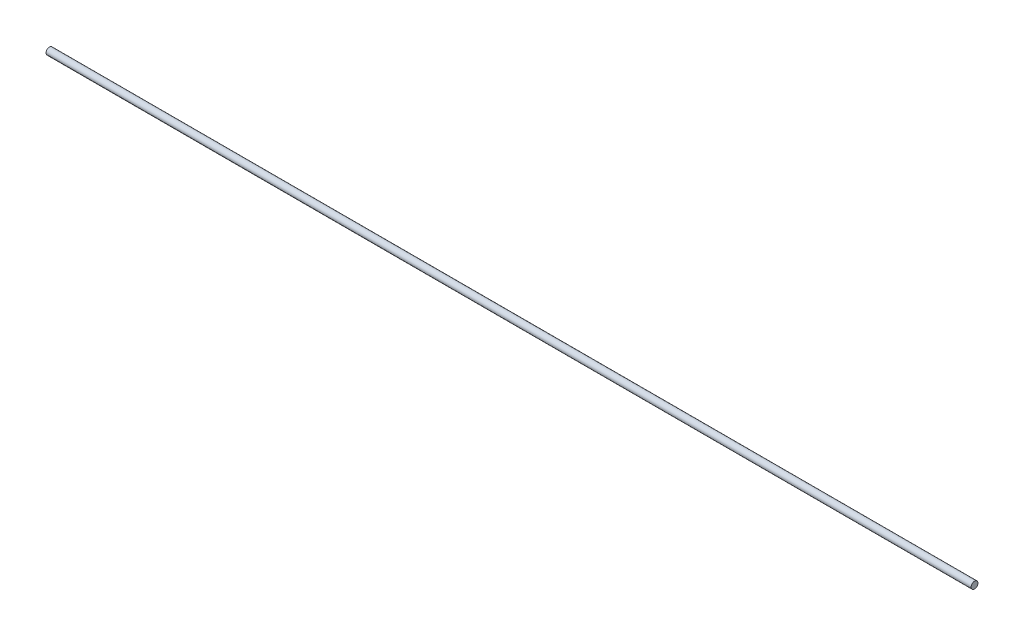
ISO-10303-21;
HEADER;
FILE_DESCRIPTION(('STEP AP214'),'2;1');
FILE_NAME('part.step','',(''),(''),'','','');
FILE_SCHEMA(('AUTOMOTIVE_DESIGN { 1 0 10303 214 1 1 1 1 }'));
ENDSEC;
DATA;
#1=APPLICATION_CONTEXT('core data for automotive mechanical design processes');
#2=APPLICATION_PROTOCOL_DEFINITION('international standard','automotive_design',2000,#1);
#3=PRODUCT_CONTEXT('',#1,'mechanical');
#4=PRODUCT('Part','Part','',(#3));
#5=PRODUCT_RELATED_PRODUCT_CATEGORY('part','',(#4));
#6=PRODUCT_DEFINITION_FORMATION('','',#4);
#7=PRODUCT_DEFINITION_CONTEXT('part definition',#1,'design');
#8=PRODUCT_DEFINITION('design','',#6,#7);
#9=PRODUCT_DEFINITION_SHAPE('','',#8);
#10=(LENGTH_UNIT() NAMED_UNIT(*) SI_UNIT(.MILLI.,.METRE.));
#11=(NAMED_UNIT(*) PLANE_ANGLE_UNIT() SI_UNIT($,.RADIAN.));
#12=(NAMED_UNIT(*) SI_UNIT($,.STERADIAN.) SOLID_ANGLE_UNIT());
#13=UNCERTAINTY_MEASURE_WITH_UNIT(LENGTH_MEASURE(1.E-05),#10,'distance_accuracy_value','');
#14=(GEOMETRIC_REPRESENTATION_CONTEXT(3) GLOBAL_UNCERTAINTY_ASSIGNED_CONTEXT((#13)) GLOBAL_UNIT_ASSIGNED_CONTEXT((#10,
#11,#12)) REPRESENTATION_CONTEXT('',''));
#15=CARTESIAN_POINT('',(0.,0.,0.));
#16=DIRECTION('',(0.,0.,1.));
#17=DIRECTION('',(1.,0.,0.));
#18=AXIS2_PLACEMENT_3D('',#15,#16,#17);
#19=CARTESIAN_POINT('',(812.8,16.2262414710301,4.7956111171722));
#20=DIRECTION('',(-1.,0.,0.));
#21=DIRECTION('',(0.,0.,-1.));
#22=AXIS2_PLACEMENT_3D('',#19,#20,#21);
#23=CYLINDRICAL_SURFACE('',#22,3.);
#24=CARTESIAN_POINT('',(812.8,16.2262414710301,4.7956111171722));
#25=DIRECTION('',(-1.,0.,0.));
#26=DIRECTION('',(0.,0.,1.));
#27=AXIS2_PLACEMENT_3D('',#24,#25,#26);
#28=CIRCLE('',#27,3.);
#29=CARTESIAN_POINT('',(812.8,16.2262414710301,7.7956111171722));
#30=VERTEX_POINT('',#29);
#31=EDGE_CURVE('E10',#30,#30,#28,.T.);
#32=ORIENTED_EDGE('',*,*,#31,.T.);
#33=EDGE_LOOP('',(#32));
#34=FACE_BOUND('',#33,.T.);
#35=CARTESIAN_POINT('',(0.,16.2262414710301,4.7956111171722));
#36=DIRECTION('',(-1.,0.,0.));
#37=DIRECTION('',(0.,0.,1.));
#38=AXIS2_PLACEMENT_3D('',#35,#36,#37);
#39=CIRCLE('',#38,3.);
#40=CARTESIAN_POINT('',(0.,16.2262414710301,7.7956111171722));
#41=VERTEX_POINT('',#40);
#42=EDGE_CURVE('E38',#41,#41,#39,.T.);
#43=ORIENTED_EDGE('',*,*,#42,.F.);
#44=EDGE_LOOP('',(#43));
#45=FACE_BOUND('',#44,.T.);
#46=ADVANCED_FACE('F35',(#34,#45),#23,.T.);
#47=CARTESIAN_POINT('',(812.8,16.2262414710301,4.7956111171722));
#48=DIRECTION('',(1.,0.,0.));
#49=DIRECTION('',(0.,0.,1.));
#50=AXIS2_PLACEMENT_3D('',#47,#48,#49);
#51=PLANE('',#50);
#52=ORIENTED_EDGE('',*,*,#31,.F.);
#53=EDGE_LOOP('',(#52));
#54=FACE_BOUND('',#53,.T.);
#55=ADVANCED_FACE('F50',(#54),#51,.T.);
#56=CARTESIAN_POINT('',(0.,16.2262414710301,4.7956111171722));
#57=DIRECTION('',(1.,0.,0.));
#58=DIRECTION('',(0.,0.,1.));
#59=AXIS2_PLACEMENT_3D('',#56,#57,#58);
#60=PLANE('',#59);
#61=ORIENTED_EDGE('',*,*,#42,.T.);
#62=EDGE_LOOP('',(#61));
#63=FACE_BOUND('',#62,.T.);
#64=ADVANCED_FACE('F47',(#63),#60,.F.);
#65=CLOSED_SHELL('',(#46,#55,#64));
#66=MANIFOLD_SOLID_BREP('B2',#65);
#67=ADVANCED_BREP_SHAPE_REPRESENTATION('',(#18,#66),#14);
#68=SHAPE_DEFINITION_REPRESENTATION(#9,#67);
ENDSEC;
END-ISO-10303-21;
